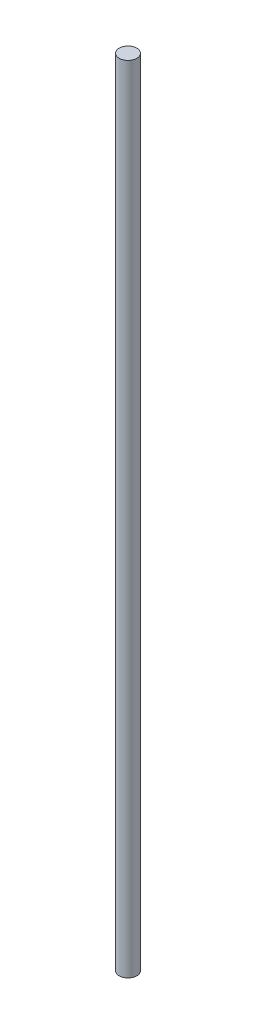
ISO-10303-21;
HEADER;
FILE_DESCRIPTION(('STEP AP214'),'2;1');
FILE_NAME('part.step','',(''),(''),'','','');
FILE_SCHEMA(('AUTOMOTIVE_DESIGN { 1 0 10303 214 1 1 1 1 }'));
ENDSEC;
DATA;
#1=APPLICATION_CONTEXT('core data for automotive mechanical design processes');
#2=APPLICATION_PROTOCOL_DEFINITION('international standard','automotive_design',2000,#1);
#3=PRODUCT_CONTEXT('',#1,'mechanical');
#4=PRODUCT('Part','Part','',(#3));
#5=PRODUCT_RELATED_PRODUCT_CATEGORY('part','',(#4));
#6=PRODUCT_DEFINITION_FORMATION('','',#4);
#7=PRODUCT_DEFINITION_CONTEXT('part definition',#1,'design');
#8=PRODUCT_DEFINITION('design','',#6,#7);
#9=PRODUCT_DEFINITION_SHAPE('','',#8);
#10=(LENGTH_UNIT() NAMED_UNIT(*) SI_UNIT(.MILLI.,.METRE.));
#11=(NAMED_UNIT(*) PLANE_ANGLE_UNIT() SI_UNIT($,.RADIAN.));
#12=(NAMED_UNIT(*) SI_UNIT($,.STERADIAN.) SOLID_ANGLE_UNIT());
#13=UNCERTAINTY_MEASURE_WITH_UNIT(LENGTH_MEASURE(1.E-05),#10,'distance_accuracy_value','');
#14=(GEOMETRIC_REPRESENTATION_CONTEXT(3) GLOBAL_UNCERTAINTY_ASSIGNED_CONTEXT((#13)) GLOBAL_UNIT_ASSIGNED_CONTEXT((#10,
#11,#12)) REPRESENTATION_CONTEXT('',''));
#15=CARTESIAN_POINT('',(0.,0.,0.));
#16=DIRECTION('',(0.,0.,1.));
#17=DIRECTION('',(1.,0.,0.));
#18=AXIS2_PLACEMENT_3D('',#15,#16,#17);
#19=CARTESIAN_POINT('',(0.,270.,0.));
#20=DIRECTION('',(0.,-1.,0.));
#21=DIRECTION('',(1.,0.,0.));
#22=AXIS2_PLACEMENT_3D('',#19,#20,#21);
#23=CYLINDRICAL_SURFACE('',#22,3.00000000000002);
#24=CARTESIAN_POINT('',(0.,270.,0.));
#25=DIRECTION('',(0.,-1.,0.));
#26=DIRECTION('',(1.,0.,0.));
#27=AXIS2_PLACEMENT_3D('',#24,#25,#26);
#28=CIRCLE('',#27,3.00000000000003);
#29=CARTESIAN_POINT('',(3.,270.,0.));
#30=VERTEX_POINT('',#29);
#31=EDGE_CURVE('E10',#30,#30,#28,.T.);
#32=ORIENTED_EDGE('',*,*,#31,.T.);
#33=EDGE_LOOP('',(#32));
#34=FACE_BOUND('',#33,.T.);
#35=CARTESIAN_POINT('',(0.,0.,0.));
#36=DIRECTION('',(0.,-1.,0.));
#37=DIRECTION('',(1.,0.,0.));
#38=AXIS2_PLACEMENT_3D('',#35,#36,#37);
#39=CIRCLE('',#38,3.);
#40=CARTESIAN_POINT('',(3.,0.,0.));
#41=VERTEX_POINT('',#40);
#42=EDGE_CURVE('E39',#41,#41,#39,.T.);
#43=ORIENTED_EDGE('',*,*,#42,.F.);
#44=EDGE_LOOP('',(#43));
#45=FACE_BOUND('',#44,.T.);
#46=ADVANCED_FACE('F33',(#34,#45),#23,.T.);
#47=CARTESIAN_POINT('',(3.,270.,0.));
#48=DIRECTION('',(0.,1.,0.));
#49=DIRECTION('',(-1.,0.,0.));
#50=AXIS2_PLACEMENT_3D('',#47,#48,#49);
#51=PLANE('',#50);
#52=ORIENTED_EDGE('',*,*,#31,.F.);
#53=EDGE_LOOP('',(#52));
#54=FACE_BOUND('',#53,.T.);
#55=ADVANCED_FACE('F48',(#54),#51,.T.);
#56=CARTESIAN_POINT('',(0.,0.,0.));
#57=DIRECTION('',(0.,-1.,0.));
#58=DIRECTION('',(1.,0.,0.));
#59=AXIS2_PLACEMENT_3D('',#56,#57,#58);
#60=PLANE('',#59);
#61=ORIENTED_EDGE('',*,*,#42,.T.);
#62=EDGE_LOOP('',(#61));
#63=FACE_BOUND('',#62,.T.);
#64=ADVANCED_FACE('F45',(#63),#60,.T.);
#65=CLOSED_SHELL('',(#46,#55,#64));
#66=MANIFOLD_SOLID_BREP('B2',#65);
#67=ADVANCED_BREP_SHAPE_REPRESENTATION('',(#18,#66),#14);
#68=SHAPE_DEFINITION_REPRESENTATION(#9,#67);
ENDSEC;
END-ISO-10303-21;
